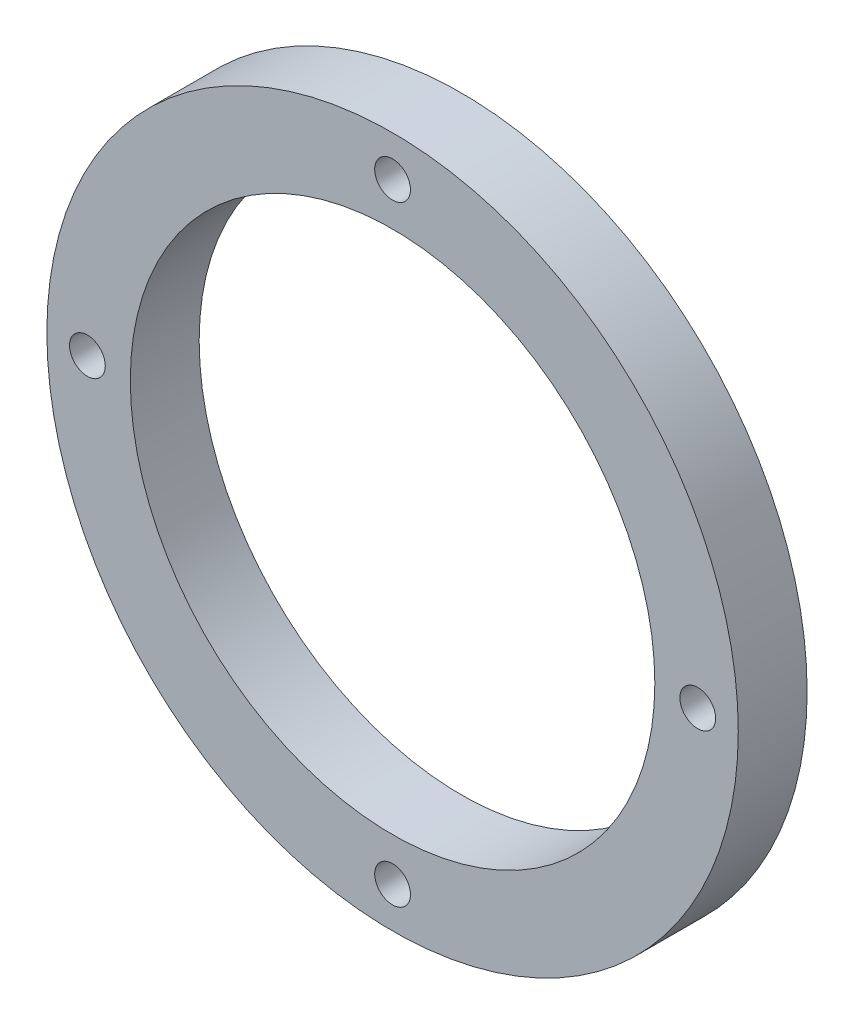
ISO-10303-21;
HEADER;
FILE_DESCRIPTION(('STEP AP214'),'2;1');
FILE_NAME('part.step','',(''),(''),'','','');
FILE_SCHEMA(('AUTOMOTIVE_DESIGN { 1 0 10303 214 1 1 1 1 }'));
ENDSEC;
DATA;
#1=APPLICATION_CONTEXT('core data for automotive mechanical design processes');
#2=APPLICATION_PROTOCOL_DEFINITION('international standard','automotive_design',2000,#1);
#3=PRODUCT_CONTEXT('',#1,'mechanical');
#4=PRODUCT('Part','Part','',(#3));
#5=PRODUCT_RELATED_PRODUCT_CATEGORY('part','',(#4));
#6=PRODUCT_DEFINITION_FORMATION('','',#4);
#7=PRODUCT_DEFINITION_CONTEXT('part definition',#1,'design');
#8=PRODUCT_DEFINITION('design','',#6,#7);
#9=PRODUCT_DEFINITION_SHAPE('','',#8);
#10=(LENGTH_UNIT() NAMED_UNIT(*) SI_UNIT(.MILLI.,.METRE.));
#11=(NAMED_UNIT(*) PLANE_ANGLE_UNIT() SI_UNIT($,.RADIAN.));
#12=(NAMED_UNIT(*) SI_UNIT($,.STERADIAN.) SOLID_ANGLE_UNIT());
#13=UNCERTAINTY_MEASURE_WITH_UNIT(LENGTH_MEASURE(1.E-05),#10,'distance_accuracy_value','');
#14=(GEOMETRIC_REPRESENTATION_CONTEXT(3) GLOBAL_UNCERTAINTY_ASSIGNED_CONTEXT((#13)) GLOBAL_UNIT_ASSIGNED_CONTEXT((#10,
#11,#12)) REPRESENTATION_CONTEXT('',''));
#15=CARTESIAN_POINT('',(0.,0.,0.));
#16=DIRECTION('',(0.,0.,1.));
#17=DIRECTION('',(1.,0.,0.));
#18=AXIS2_PLACEMENT_3D('',#15,#16,#17);
#19=CARTESIAN_POINT('',(0.,0.,9.1694));
#20=DIRECTION('',(0.,0.,1.));
#21=DIRECTION('',(1.,0.,0.));
#22=AXIS2_PLACEMENT_3D('',#19,#20,#21);
#23=PLANE('',#22);
#24=CARTESIAN_POINT('',(1.16454718221541E-12,-40.6399999999989,9.1694));
#25=DIRECTION('',(0.,0.,1.));
#26=DIRECTION('',(1.,0.,0.));
#27=AXIS2_PLACEMENT_3D('',#24,#25,#26);
#28=CIRCLE('',#27,2.38125000000172);
#29=CARTESIAN_POINT('',(2.38125000000288,-40.6399999999989,9.1694));
#30=VERTEX_POINT('',#29);
#31=EDGE_CURVE('E63',#30,#30,#28,.T.);
#32=ORIENTED_EDGE('',*,*,#31,.F.);
#33=EDGE_LOOP('',(#32));
#34=FACE_BOUND('',#33,.T.);
#35=CARTESIAN_POINT('',(0.,40.64,9.1694));
#36=DIRECTION('',(0.,0.,1.));
#37=DIRECTION('',(1.,0.,0.));
#38=AXIS2_PLACEMENT_3D('',#35,#36,#37);
#39=CIRCLE('',#38,2.38125);
#40=CARTESIAN_POINT('',(2.38125,40.64,9.1694));
#41=VERTEX_POINT('',#40);
#42=EDGE_CURVE('E51',#41,#41,#39,.T.);
#43=ORIENTED_EDGE('',*,*,#42,.F.);
#44=EDGE_LOOP('',(#43));
#45=FACE_BOUND('',#44,.T.);
#46=CARTESIAN_POINT('',(0.,0.,9.1694));
#47=DIRECTION('',(0.,0.,1.));
#48=DIRECTION('',(1.,0.,0.));
#49=AXIS2_PLACEMENT_3D('',#46,#47,#48);
#50=CIRCLE('',#49,46.0375);
#51=CARTESIAN_POINT('',(46.0375,0.,9.1694));
#52=VERTEX_POINT('',#51);
#53=EDGE_CURVE('E10',#52,#52,#50,.T.);
#54=ORIENTED_EDGE('',*,*,#53,.T.);
#55=EDGE_LOOP('',(#54));
#56=FACE_BOUND('',#55,.T.);
#57=CARTESIAN_POINT('',(0.,0.,9.1694));
#58=DIRECTION('',(0.,0.,1.));
#59=DIRECTION('',(1.,0.,0.));
#60=AXIS2_PLACEMENT_3D('',#57,#58,#59);
#61=CIRCLE('',#60,34.925);
#62=CARTESIAN_POINT('',(34.925,0.,9.1694));
#63=VERTEX_POINT('',#62);
#64=EDGE_CURVE('E46',#63,#63,#61,.T.);
#65=ORIENTED_EDGE('',*,*,#64,.F.);
#66=EDGE_LOOP('',(#65));
#67=FACE_BOUND('',#66,.T.);
#68=CARTESIAN_POINT('',(40.64,1.13300163564905E-12,9.1694));
#69=DIRECTION('',(0.,0.,1.));
#70=DIRECTION('',(1.,0.,0.));
#71=AXIS2_PLACEMENT_3D('',#68,#69,#70);
#72=CIRCLE('',#71,2.38125000000122);
#73=CARTESIAN_POINT('',(43.0212500000012,1.13300163564905E-12,9.1694));
#74=VERTEX_POINT('',#73);
#75=EDGE_CURVE('E57',#74,#74,#72,.T.);
#76=ORIENTED_EDGE('',*,*,#75,.F.);
#77=EDGE_LOOP('',(#76));
#78=FACE_BOUND('',#77,.T.);
#79=CARTESIAN_POINT('',(-40.6399999999989,0.,9.1694));
#80=DIRECTION('',(0.,0.,1.));
#81=DIRECTION('',(1.,0.,0.));
#82=AXIS2_PLACEMENT_3D('',#79,#80,#81);
#83=CIRCLE('',#82,2.38125000000074);
#84=CARTESIAN_POINT('',(-38.2587499999981,0.,9.1694));
#85=VERTEX_POINT('',#84);
#86=EDGE_CURVE('E69',#85,#85,#83,.T.);
#87=ORIENTED_EDGE('',*,*,#86,.F.);
#88=EDGE_LOOP('',(#87));
#89=FACE_BOUND('',#88,.T.);
#90=ADVANCED_FACE('F35',(#34,#45,#56,#67,#78,#89),#23,.T.);
#91=CARTESIAN_POINT('',(0.,0.,0.));
#92=DIRECTION('',(0.,0.,1.));
#93=DIRECTION('',(1.,0.,0.));
#94=AXIS2_PLACEMENT_3D('',#91,#92,#93);
#95=PLANE('',#94);
#96=CARTESIAN_POINT('',(0.,0.,0.));
#97=DIRECTION('',(0.,0.,1.));
#98=DIRECTION('',(1.,0.,0.));
#99=AXIS2_PLACEMENT_3D('',#96,#97,#98);
#100=CIRCLE('',#99,46.0375);
#101=CARTESIAN_POINT('',(46.0375,0.,0.));
#102=VERTEX_POINT('',#101);
#103=EDGE_CURVE('E39',#102,#102,#100,.T.);
#104=ORIENTED_EDGE('',*,*,#103,.F.);
#105=EDGE_LOOP('',(#104));
#106=FACE_BOUND('',#105,.T.);
#107=CARTESIAN_POINT('',(0.,0.,0.));
#108=DIRECTION('',(0.,0.,1.));
#109=DIRECTION('',(1.,0.,0.));
#110=AXIS2_PLACEMENT_3D('',#107,#108,#109);
#111=CIRCLE('',#110,34.925);
#112=CARTESIAN_POINT('',(34.925,0.,0.));
#113=VERTEX_POINT('',#112);
#114=EDGE_CURVE('E48',#113,#113,#111,.T.);
#115=ORIENTED_EDGE('',*,*,#114,.T.);
#116=EDGE_LOOP('',(#115));
#117=FACE_BOUND('',#116,.T.);
#118=CARTESIAN_POINT('',(0.,40.64,0.));
#119=DIRECTION('',(0.,0.,1.));
#120=DIRECTION('',(1.,0.,0.));
#121=AXIS2_PLACEMENT_3D('',#118,#119,#120);
#122=CIRCLE('',#121,2.38125);
#123=CARTESIAN_POINT('',(2.38125,40.64,0.));
#124=VERTEX_POINT('',#123);
#125=EDGE_CURVE('E54',#124,#124,#122,.T.);
#126=ORIENTED_EDGE('',*,*,#125,.T.);
#127=EDGE_LOOP('',(#126));
#128=FACE_BOUND('',#127,.T.);
#129=CARTESIAN_POINT('',(40.64,1.13300163564905E-12,0.));
#130=DIRECTION('',(0.,0.,1.));
#131=DIRECTION('',(1.,0.,0.));
#132=AXIS2_PLACEMENT_3D('',#129,#130,#131);
#133=CIRCLE('',#132,2.38125000000122);
#134=CARTESIAN_POINT('',(43.0212500000012,1.13300163564905E-12,0.));
#135=VERTEX_POINT('',#134);
#136=EDGE_CURVE('E60',#135,#135,#133,.T.);
#137=ORIENTED_EDGE('',*,*,#136,.T.);
#138=EDGE_LOOP('',(#137));
#139=FACE_BOUND('',#138,.T.);
#140=CARTESIAN_POINT('',(1.16454718221541E-12,-40.6399999999989,0.));
#141=DIRECTION('',(0.,0.,1.));
#142=DIRECTION('',(1.,0.,0.));
#143=AXIS2_PLACEMENT_3D('',#140,#141,#142);
#144=CIRCLE('',#143,2.38125000000172);
#145=CARTESIAN_POINT('',(2.38125000000288,-40.6399999999989,0.));
#146=VERTEX_POINT('',#145);
#147=EDGE_CURVE('E66',#146,#146,#144,.T.);
#148=ORIENTED_EDGE('',*,*,#147,.T.);
#149=EDGE_LOOP('',(#148));
#150=FACE_BOUND('',#149,.T.);
#151=CARTESIAN_POINT('',(-40.6399999999989,0.,0.));
#152=DIRECTION('',(0.,0.,1.));
#153=DIRECTION('',(1.,0.,0.));
#154=AXIS2_PLACEMENT_3D('',#151,#152,#153);
#155=CIRCLE('',#154,2.38125000000074);
#156=CARTESIAN_POINT('',(-38.2587499999981,0.,0.));
#157=VERTEX_POINT('',#156);
#158=EDGE_CURVE('E72',#157,#157,#155,.T.);
#159=ORIENTED_EDGE('',*,*,#158,.T.);
#160=EDGE_LOOP('',(#159));
#161=FACE_BOUND('',#160,.T.);
#162=ADVANCED_FACE('F82',(#106,#117,#128,#139,#150,#161),#95,.F.);
#163=CARTESIAN_POINT('',(0.,0.,9.1694));
#164=DIRECTION('',(0.,0.,-1.));
#165=DIRECTION('',(-1.,0.,0.));
#166=AXIS2_PLACEMENT_3D('',#163,#164,#165);
#167=CYLINDRICAL_SURFACE('',#166,46.0375);
#168=ORIENTED_EDGE('',*,*,#53,.F.);
#169=EDGE_LOOP('',(#168));
#170=FACE_BOUND('',#169,.T.);
#171=ORIENTED_EDGE('',*,*,#103,.T.);
#172=EDGE_LOOP('',(#171));
#173=FACE_BOUND('',#172,.T.);
#174=ADVANCED_FACE('F37',(#170,#173),#167,.T.);
#175=CARTESIAN_POINT('',(0.,0.,9.1694));
#176=DIRECTION('',(0.,0.,-1.));
#177=DIRECTION('',(-1.,0.,0.));
#178=AXIS2_PLACEMENT_3D('',#175,#176,#177);
#179=CYLINDRICAL_SURFACE('',#178,34.925);
#180=ORIENTED_EDGE('',*,*,#64,.T.);
#181=EDGE_LOOP('',(#180));
#182=FACE_BOUND('',#181,.T.);
#183=ORIENTED_EDGE('',*,*,#114,.F.);
#184=EDGE_LOOP('',(#183));
#185=FACE_BOUND('',#184,.T.);
#186=ADVANCED_FACE('F92',(#182,#185),#179,.F.);
#187=CARTESIAN_POINT('',(0.,40.64,9.1694));
#188=DIRECTION('',(0.,0.,-1.));
#189=DIRECTION('',(-1.,0.,0.));
#190=AXIS2_PLACEMENT_3D('',#187,#188,#189);
#191=CYLINDRICAL_SURFACE('',#190,2.38125);
#192=ORIENTED_EDGE('',*,*,#42,.T.);
#193=EDGE_LOOP('',(#192));
#194=FACE_BOUND('',#193,.T.);
#195=ORIENTED_EDGE('',*,*,#125,.F.);
#196=EDGE_LOOP('',(#195));
#197=FACE_BOUND('',#196,.T.);
#198=ADVANCED_FACE('F95',(#194,#197),#191,.F.);
#199=CARTESIAN_POINT('',(40.64,1.13300163564905E-12,9.1694));
#200=DIRECTION('',(0.,0.,-1.));
#201=DIRECTION('',(-1.,0.,0.));
#202=AXIS2_PLACEMENT_3D('',#199,#200,#201);
#203=CYLINDRICAL_SURFACE('',#202,2.38125000000122);
#204=ORIENTED_EDGE('',*,*,#75,.T.);
#205=EDGE_LOOP('',(#204));
#206=FACE_BOUND('',#205,.T.);
#207=ORIENTED_EDGE('',*,*,#136,.F.);
#208=EDGE_LOOP('',(#207));
#209=FACE_BOUND('',#208,.T.);
#210=ADVANCED_FACE('F99',(#206,#209),#203,.F.);
#211=CARTESIAN_POINT('',(1.16454718221541E-12,-40.6399999999989,9.1694));
#212=DIRECTION('',(0.,0.,-1.));
#213=DIRECTION('',(-1.,0.,0.));
#214=AXIS2_PLACEMENT_3D('',#211,#212,#213);
#215=CYLINDRICAL_SURFACE('',#214,2.38125000000172);
#216=ORIENTED_EDGE('',*,*,#31,.T.);
#217=EDGE_LOOP('',(#216));
#218=FACE_BOUND('',#217,.T.);
#219=ORIENTED_EDGE('',*,*,#147,.F.);
#220=EDGE_LOOP('',(#219));
#221=FACE_BOUND('',#220,.T.);
#222=ADVANCED_FACE('F103',(#218,#221),#215,.F.);
#223=CARTESIAN_POINT('',(-40.6399999999989,0.,9.1694));
#224=DIRECTION('',(0.,0.,-1.));
#225=DIRECTION('',(-1.,0.,0.));
#226=AXIS2_PLACEMENT_3D('',#223,#224,#225);
#227=CYLINDRICAL_SURFACE('',#226,2.38125000000074);
#228=ORIENTED_EDGE('',*,*,#86,.T.);
#229=EDGE_LOOP('',(#228));
#230=FACE_BOUND('',#229,.T.);
#231=ORIENTED_EDGE('',*,*,#158,.F.);
#232=EDGE_LOOP('',(#231));
#233=FACE_BOUND('',#232,.T.);
#234=ADVANCED_FACE('F78',(#230,#233),#227,.F.);
#235=CLOSED_SHELL('',(#90,#162,#174,#186,#198,#210,#222,#234));
#236=MANIFOLD_SOLID_BREP('B2',#235);
#237=ADVANCED_BREP_SHAPE_REPRESENTATION('',(#18,#236),#14);
#238=SHAPE_DEFINITION_REPRESENTATION(#9,#237);
ENDSEC;
END-ISO-10303-21;
